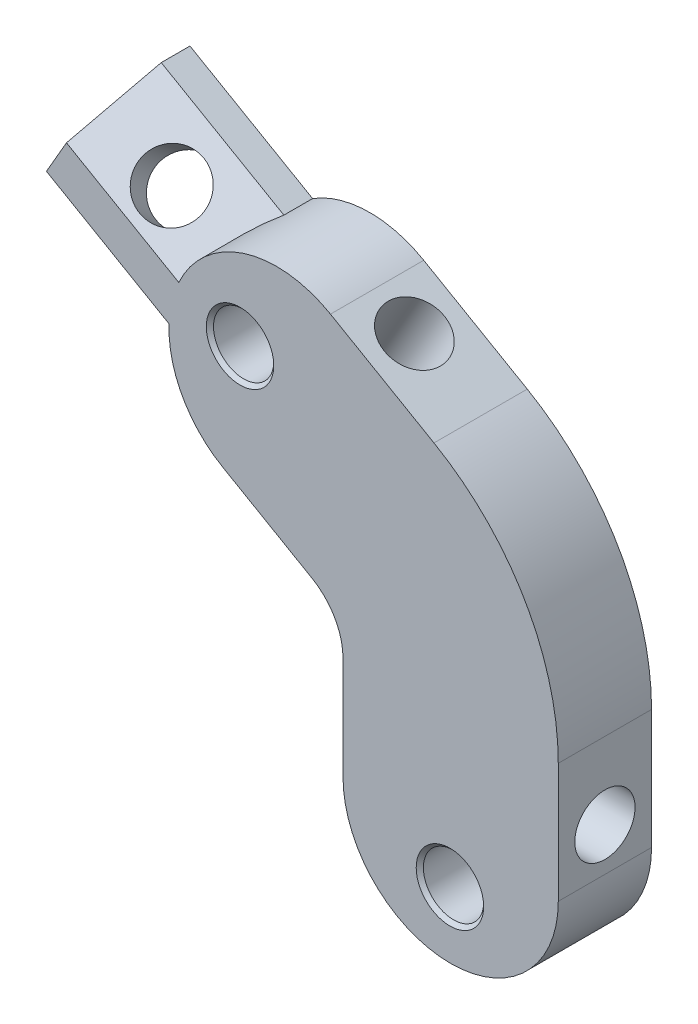
ISO-10303-21;
HEADER;
FILE_DESCRIPTION(('STEP AP214'),'2;1');
FILE_NAME('part.step','',(''),(''),'','','');
FILE_SCHEMA(('AUTOMOTIVE_DESIGN { 1 0 10303 214 1 1 1 1 }'));
ENDSEC;
DATA;
#1=APPLICATION_CONTEXT('core data for automotive mechanical design processes');
#2=APPLICATION_PROTOCOL_DEFINITION('international standard','automotive_design',2000,#1);
#3=PRODUCT_CONTEXT('',#1,'mechanical');
#4=PRODUCT('Part','Part','',(#3));
#5=PRODUCT_RELATED_PRODUCT_CATEGORY('part','',(#4));
#6=PRODUCT_DEFINITION_FORMATION('','',#4);
#7=PRODUCT_DEFINITION_CONTEXT('part definition',#1,'design');
#8=PRODUCT_DEFINITION('design','',#6,#7);
#9=PRODUCT_DEFINITION_SHAPE('','',#8);
#10=(LENGTH_UNIT() NAMED_UNIT(*) SI_UNIT(.MILLI.,.METRE.));
#11=(NAMED_UNIT(*) PLANE_ANGLE_UNIT() SI_UNIT($,.RADIAN.));
#12=(NAMED_UNIT(*) SI_UNIT($,.STERADIAN.) SOLID_ANGLE_UNIT());
#13=UNCERTAINTY_MEASURE_WITH_UNIT(LENGTH_MEASURE(1.E-05),#10,'distance_accuracy_value','');
#14=(GEOMETRIC_REPRESENTATION_CONTEXT(3) GLOBAL_UNCERTAINTY_ASSIGNED_CONTEXT((#13)) GLOBAL_UNIT_ASSIGNED_CONTEXT((#10,
#11,#12)) REPRESENTATION_CONTEXT('',''));
#15=CARTESIAN_POINT('',(0.,0.,0.));
#16=DIRECTION('',(0.,0.,1.));
#17=DIRECTION('',(1.,0.,0.));
#18=AXIS2_PLACEMENT_3D('',#15,#16,#17);
#19=CARTESIAN_POINT('',(-19.6410166168552,-11.3397456934119,13.));
#20=DIRECTION('',(0.,0.,-1.));
#21=DIRECTION('',(-1.,0.,0.));
#22=AXIS2_PLACEMENT_3D('',#19,#20,#21);
#23=CYLINDRICAL_SURFACE('',#22,34.6410161513777);
#24=CARTESIAN_POINT('',(-19.6410166168552,-11.3397456934119,0.));
#25=DIRECTION('',(0.,0.,-1.));
#26=DIRECTION('',(-1.,0.,0.));
#27=AXIS2_PLACEMENT_3D('',#24,#25,#26);
#28=CIRCLE('',#27,34.6410161513777);
#29=CARTESIAN_POINT('',(14.9999995345225,-11.3397456934127,0.));
#30=VERTEX_POINT('',#29);
#31=CARTESIAN_POINT('',(-2.32050854116668,18.6602543065882,0.));
#32=VERTEX_POINT('',#31);
#33=EDGE_CURVE('E219',#30,#32,#28,.F.);
#34=ORIENTED_EDGE('',*,*,#33,.F.);
#35=DIRECTION('',(0.,0.,-1.));
#36=VECTOR('',#35,1.);
#37=CARTESIAN_POINT('',(14.9999995345227,-11.3397456934127,13.));
#38=LINE('',#37,#36);
#39=CARTESIAN_POINT('',(14.9999995345227,-11.3397456934127,-13.));
#40=VERTEX_POINT('',#39);
#41=EDGE_CURVE('E38',#30,#40,#38,.T.);
#42=ORIENTED_EDGE('',*,*,#41,.T.);
#43=CARTESIAN_POINT('',(-19.6410166168552,-11.3397456934119,-13.));
#44=DIRECTION('',(0.,0.,-1.));
#45=DIRECTION('',(-1.,0.,0.));
#46=AXIS2_PLACEMENT_3D('',#43,#44,#45);
#47=CIRCLE('',#46,34.6410161513777);
#48=CARTESIAN_POINT('',(-2.32050854116668,18.6602543065882,-13.));
#49=VERTEX_POINT('',#48);
#50=EDGE_CURVE('E218',#49,#40,#47,.T.);
#51=ORIENTED_EDGE('',*,*,#50,.F.);
#52=DIRECTION('',(0.,0.,-1.));
#53=VECTOR('',#52,1.);
#54=CARTESIAN_POINT('',(-2.32050854116668,18.6602543065882,13.));
#55=LINE('',#54,#53);
#56=EDGE_CURVE('E11',#32,#49,#55,.T.);
#57=ORIENTED_EDGE('',*,*,#56,.F.);
#58=EDGE_LOOP('',(#34,#42,#51,#57));
#59=FACE_BOUND('',#58,.T.);
#60=ADVANCED_FACE('F35',(#59),#23,.T.);
#61=CARTESIAN_POINT('',(-16.7487113059647,26.9903810567665,13.));
#62=DIRECTION('',(0.499999999999985,0.866025403784447,0.));
#63=DIRECTION('',(-0.866025403784447,0.499999999999985,0.));
#64=AXIS2_PLACEMENT_3D('',#61,#62,#63);
#65=PLANE('',#64);
#66=DIRECTION('',(-0.866025403784447,0.499999999999985,0.));
#67=VECTOR('',#66,1.);
#68=CARTESIAN_POINT('',(-16.7487113059647,26.9903810567665,0.));
#69=LINE('',#68,#67);
#70=CARTESIAN_POINT('',(-16.7487113059647,26.9903810567665,0.));
#71=VERTEX_POINT('',#70);
#72=EDGE_CURVE('E610',#32,#71,#69,.T.);
#73=ORIENTED_EDGE('',*,*,#72,.F.);
#74=ORIENTED_EDGE('',*,*,#56,.T.);
#75=DIRECTION('',(0.866025403784447,-0.499999999999985,0.));
#76=VECTOR('',#75,1.);
#77=CARTESIAN_POINT('',(-16.7487113059647,26.9903810567665,-13.));
#78=LINE('',#77,#76);
#79=CARTESIAN_POINT('',(-16.7487113059647,26.9903810567665,-13.));
#80=VERTEX_POINT('',#79);
#81=EDGE_CURVE('E232',#80,#49,#78,.T.);
#82=ORIENTED_EDGE('',*,*,#81,.F.);
#83=DIRECTION('',(0.,0.,-1.));
#84=VECTOR('',#83,1.);
#85=CARTESIAN_POINT('',(-16.7487113059647,26.9903810567665,13.));
#86=LINE('',#85,#84);
#87=EDGE_CURVE('E43',#71,#80,#86,.T.);
#88=ORIENTED_EDGE('',*,*,#87,.F.);
#89=EDGE_LOOP('',(#73,#74,#82,#88));
#90=FACE_BOUND('',#89,.T.);
#91=CARTESIAN_POINT('',(-11.5525588832577,23.9903810567665,-6.5));
#92=DIRECTION('',(-0.499999999999985,-0.866025403784447,0.));
#93=DIRECTION('',(-0.866025403784447,0.499999999999985,0.));
#94=AXIS2_PLACEMENT_3D('',#91,#92,#93);
#95=CIRCLE('',#94,4.20000000000004);
#96=CARTESIAN_POINT('',(-15.1898655791524,26.0903810567664,-6.5));
#97=VERTEX_POINT('',#96);
#98=EDGE_CURVE('E233',#97,#97,#95,.T.);
#99=ORIENTED_EDGE('',*,*,#98,.T.);
#100=EDGE_LOOP('',(#99));
#101=FACE_BOUND('',#100,.T.);
#102=ADVANCED_FACE('F309',(#90,#101),#65,.T.);
#103=CARTESIAN_POINT('',(-24.2487113059644,14.,13.));
#104=DIRECTION('',(0.,0.,-1.));
#105=DIRECTION('',(-1.,0.,0.));
#106=AXIS2_PLACEMENT_3D('',#103,#104,#105);
#107=CYLINDRICAL_SURFACE('',#106,14.9999999999998);
#108=CARTESIAN_POINT('',(-24.2487113059644,14.,0.));
#109=DIRECTION('',(0.,0.,-1.));
#110=DIRECTION('',(-1.,0.,0.));
#111=AXIS2_PLACEMENT_3D('',#108,#109,#110);
#112=CIRCLE('',#111,14.9999999999998);
#113=CARTESIAN_POINT('',(-37.8866435687405,20.245542698271,0.));
#114=VERTEX_POINT('',#113);
#115=EDGE_CURVE('E51',#71,#114,#112,.F.);
#116=ORIENTED_EDGE('',*,*,#115,.F.);
#117=ORIENTED_EDGE('',*,*,#87,.T.);
#118=CARTESIAN_POINT('',(-24.248711305964,13.9999999999998,-13.));
#119=DIRECTION('',(0.,0.,-1.));
#120=DIRECTION('',(-1.,0.,0.));
#121=AXIS2_PLACEMENT_3D('',#118,#119,#120);
#122=CIRCLE('',#121,15.0000000000002);
#123=CARTESIAN_POINT('',(-32.2378365990401,26.6954274072018,-13.));
#124=VERTEX_POINT('',#123);
#125=EDGE_CURVE('E256',#124,#80,#122,.T.);
#126=ORIENTED_EDGE('',*,*,#125,.F.);
#127=DIRECTION('',(0.,0.,1.));
#128=VECTOR('',#127,1.);
#129=CARTESIAN_POINT('',(-32.2378365990401,26.6954274072018,-13.));
#130=LINE('',#129,#128);
#131=CARTESIAN_POINT('',(-32.2378365990401,26.6954274072018,-9.00000000000002));
#132=VERTEX_POINT('',#131);
#133=EDGE_CURVE('E145',#124,#132,#130,.T.);
#134=ORIENTED_EDGE('',*,*,#133,.T.);
#135=CARTESIAN_POINT('',(-24.2487113059644,14.,-1.50906714486256));
#136=DIRECTION('',(0.365321701822529,0.632755748664128,0.68275926702608));
#137=DIRECTION('',(-0.341379633513048,-0.591286869913824,0.730643403645041));
#138=AXIS2_PLACEMENT_3D('',#135,#136,#137);
#139=ELLIPSE('',#138,21.969676172007,14.9999999999998);
#140=EDGE_CURVE('E159',#114,#132,#139,.F.);
#141=ORIENTED_EDGE('',*,*,#140,.F.);
#142=EDGE_LOOP('',(#116,#117,#126,#134,#141));
#143=FACE_BOUND('',#142,.T.);
#144=ADVANCED_FACE('F313',(#143),#107,.T.);
#145=CARTESIAN_POINT('',(-52.8275496308505,30.5000000000002,13.));
#146=DIRECTION('',(-0.866025403784432,0.500000000000012,0.));
#147=DIRECTION('',(-0.500000000000012,-0.866025403784432,0.));
#148=AXIS2_PLACEMENT_3D('',#145,#146,#147);
#149=PLANE('',#148);
#150=DIRECTION('',(-0.500000000000012,-0.866025403784432,0.));
#151=VECTOR('',#150,1.);
#152=CARTESIAN_POINT('',(-52.8275496308505,30.5000000000002,0.));
#153=LINE('',#152,#151);
#154=CARTESIAN_POINT('',(-53.532633377983,29.2787591263756,0.));
#155=VERTEX_POINT('',#154);
#156=CARTESIAN_POINT('',(-56.3275496308506,24.4378221735092,0.));
#157=VERTEX_POINT('',#156);
#158=EDGE_CURVE('E138',#155,#157,#153,.T.);
#159=ORIENTED_EDGE('',*,*,#158,.F.);
#160=DIRECTION('',(0.341379633513048,0.591286869913824,-0.730643403645041));
#161=VECTOR('',#160,1.);
#162=CARTESIAN_POINT('',(-49.9614032798751,35.4643111018175,-7.64338425004915));
#163=LINE('',#162,#161);
#164=CARTESIAN_POINT('',(-49.3275496308504,36.5621778264912,-9.00000000000002));
#165=VERTEX_POINT('',#164);
#166=EDGE_CURVE('E151',#165,#155,#163,.F.);
#167=ORIENTED_EDGE('',*,*,#166,.F.);
#168=DIRECTION('',(0.,0.,1.));
#169=VECTOR('',#168,1.);
#170=CARTESIAN_POINT('',(-49.3275496308504,36.5621778264912,-13.));
#171=LINE('',#170,#169);
#172=CARTESIAN_POINT('',(-49.3275496308504,36.5621778264912,-13.));
#173=VERTEX_POINT('',#172);
#174=EDGE_CURVE('E259',#173,#165,#171,.T.);
#175=ORIENTED_EDGE('',*,*,#174,.F.);
#176=DIRECTION('',(0.500000000000011,0.866025403784432,0.));
#177=VECTOR('',#176,1.);
#178=CARTESIAN_POINT('',(-52.8275496308505,30.5000000000002,-13.));
#179=LINE('',#178,#177);
#180=CARTESIAN_POINT('',(-52.3275496308504,31.3660254037847,-13.));
#181=VERTEX_POINT('',#180);
#182=EDGE_CURVE('E252',#181,#173,#179,.T.);
#183=ORIENTED_EDGE('',*,*,#182,.F.);
#184=DIRECTION('',(0.34137963351305,0.591286869913826,-0.730643403645038));
#185=VECTOR('',#184,1.);
#186=CARTESIAN_POINT('',(-52.5606297392055,30.9623188138801,-12.5011464452699));
#187=LINE('',#186,#185);
#188=CARTESIAN_POINT('',(-56.3275496308506,24.4378221735092,-4.43893387984284));
#189=VERTEX_POINT('',#188);
#190=EDGE_CURVE('E167',#189,#181,#187,.T.);
#191=ORIENTED_EDGE('',*,*,#190,.F.);
#192=DIRECTION('',(0.,0.,-1.));
#193=VECTOR('',#192,1.);
#194=CARTESIAN_POINT('',(-56.3275496308505,24.4378221735092,13.));
#195=LINE('',#194,#193);
#196=EDGE_CURVE('E154',#157,#189,#195,.T.);
#197=ORIENTED_EDGE('',*,*,#196,.F.);
#198=EDGE_LOOP('',(#159,#167,#175,#183,#191,#197));
#199=FACE_BOUND('',#198,.T.);
#200=ADVANCED_FACE('F149',(#199),#149,.T.);
#201=CARTESIAN_POINT('',(-56.3275496308505,24.4378221735092,13.));
#202=DIRECTION('',(-0.500000000000012,-0.866025403784432,0.));
#203=DIRECTION('',(0.866025403784432,-0.500000000000012,0.));
#204=AXIS2_PLACEMENT_3D('',#201,#202,#203);
#205=PLANE('',#204);
#206=DIRECTION('',(0.866025403784432,-0.500000000000012,0.));
#207=VECTOR('',#206,1.);
#208=CARTESIAN_POINT('',(-56.3275496308505,24.4378221735092,0.));
#209=LINE('',#208,#207);
#210=CARTESIAN_POINT('',(-39.2378365990403,14.5710717542198,0.));
#211=VERTEX_POINT('',#210);
#212=EDGE_CURVE('E274',#157,#211,#209,.T.);
#213=ORIENTED_EDGE('',*,*,#212,.F.);
#214=ORIENTED_EDGE('',*,*,#196,.T.);
#215=DIRECTION('',(-0.866025403784432,0.500000000000012,0.));
#216=VECTOR('',#215,1.);
#217=CARTESIAN_POINT('',(-56.3275496308505,24.4378221735092,-4.43893387984285));
#218=LINE('',#217,#216);
#219=CARTESIAN_POINT('',(-39.2378365990403,14.5710717542198,-4.43893387984285));
#220=VERTEX_POINT('',#219);
#221=EDGE_CURVE('E161',#220,#189,#218,.T.);
#222=ORIENTED_EDGE('',*,*,#221,.F.);
#223=DIRECTION('',(0.,0.,-1.));
#224=VECTOR('',#223,1.);
#225=CARTESIAN_POINT('',(-39.2378365990403,14.5710717542198,13.));
#226=LINE('',#225,#224);
#227=EDGE_CURVE('E197',#211,#220,#226,.T.);
#228=ORIENTED_EDGE('',*,*,#227,.F.);
#229=EDGE_LOOP('',(#213,#214,#222,#228));
#230=FACE_BOUND('',#229,.T.);
#231=ADVANCED_FACE('F273',(#230),#205,.T.);
#232=CARTESIAN_POINT('',(-24.248711305964,13.9999999999998,13.));
#233=DIRECTION('',(0.,0.,-1.));
#234=DIRECTION('',(-1.,0.,0.));
#235=AXIS2_PLACEMENT_3D('',#232,#233,#234);
#236=CYLINDRICAL_SURFACE('',#235,15.0000000000002);
#237=CARTESIAN_POINT('',(-24.248711305964,13.9999999999998,0.));
#238=DIRECTION('',(0.,0.,-1.));
#239=DIRECTION('',(-1.,0.,0.));
#240=AXIS2_PLACEMENT_3D('',#237,#238,#239);
#241=CIRCLE('',#240,15.0000000000002);
#242=CARTESIAN_POINT('',(-31.7487113059642,1.00961894323307,0.));
#243=VERTEX_POINT('',#242);
#244=EDGE_CURVE('E276',#211,#243,#241,.F.);
#245=ORIENTED_EDGE('',*,*,#244,.F.);
#246=ORIENTED_EDGE('',*,*,#227,.T.);
#247=CARTESIAN_POINT('',(-24.248711305964,13.9999999999998,-11.9298667349804));
#248=DIRECTION('',(0.365321701822527,0.632755748664126,0.682759267026083));
#249=DIRECTION('',(-0.341379633513049,-0.591286869913826,0.730643403645038));
#250=AXIS2_PLACEMENT_3D('',#247,#248,#249);
#251=ELLIPSE('',#250,21.9696761720075,15.0000000000002);
#252=CARTESIAN_POINT('',(-36.71019270278,22.3493401773325,-13.));
#253=VERTEX_POINT('',#252);
#254=EDGE_CURVE('E170',#253,#220,#251,.T.);
#255=ORIENTED_EDGE('',*,*,#254,.F.);
#256=CARTESIAN_POINT('',(-24.2487113059644,14.,-13.));
#257=DIRECTION('',(0.,0.,-1.));
#258=DIRECTION('',(-1.,0.,0.));
#259=AXIS2_PLACEMENT_3D('',#256,#257,#258);
#260=CIRCLE('',#259,15.);
#261=CARTESIAN_POINT('',(-31.7487113059642,1.00961894323327,-13.));
#262=VERTEX_POINT('',#261);
#263=EDGE_CURVE('E250',#262,#253,#260,.T.);
#264=ORIENTED_EDGE('',*,*,#263,.F.);
#265=DIRECTION('',(0.,0.,-1.));
#266=VECTOR('',#265,1.);
#267=CARTESIAN_POINT('',(-31.7487113059642,1.00961894323327,13.));
#268=LINE('',#267,#266);
#269=EDGE_CURVE('E199',#243,#262,#268,.T.);
#270=ORIENTED_EDGE('',*,*,#269,.F.);
#271=EDGE_LOOP('',(#245,#246,#255,#264,#270));
#272=FACE_BOUND('',#271,.T.);
#273=ADVANCED_FACE('F331',(#272),#236,.T.);
#274=CARTESIAN_POINT('',(-19.3301274843998,-6.160253769101,13.));
#275=DIRECTION('',(-0.5,-0.866025403784439,0.));
#276=DIRECTION('',(0.866025403784439,-0.5,0.));
#277=AXIS2_PLACEMENT_3D('',#274,#275,#276);
#278=PLANE('',#277);
#279=DIRECTION('',(0.866025403784439,-0.5,0.));
#280=VECTOR('',#279,1.);
#281=CARTESIAN_POINT('',(-19.3301274843998,-6.160253769101,0.));
#282=LINE('',#281,#280);
#283=CARTESIAN_POINT('',(-19.3301274843998,-6.16025376910101,0.));
#284=VERTEX_POINT('',#283);
#285=EDGE_CURVE('E280',#243,#284,#282,.T.);
#286=ORIENTED_EDGE('',*,*,#285,.F.);
#287=ORIENTED_EDGE('',*,*,#269,.T.);
#288=DIRECTION('',(-0.866025403784439,0.5,0.));
#289=VECTOR('',#288,1.);
#290=CARTESIAN_POINT('',(-19.3301274843998,-6.160253769101,-13.));
#291=LINE('',#290,#289);
#292=CARTESIAN_POINT('',(-19.3301274843998,-6.160253769101,-13.));
#293=VERTEX_POINT('',#292);
#294=EDGE_CURVE('E247',#293,#262,#291,.T.);
#295=ORIENTED_EDGE('',*,*,#294,.F.);
#296=DIRECTION('',(0.,0.,-1.));
#297=VECTOR('',#296,1.);
#298=CARTESIAN_POINT('',(-19.3301274843998,-6.160253769101,13.));
#299=LINE('',#298,#297);
#300=EDGE_CURVE('E201',#284,#293,#299,.T.);
#301=ORIENTED_EDGE('',*,*,#300,.F.);
#302=EDGE_LOOP('',(#286,#287,#295,#301));
#303=FACE_BOUND('',#302,.T.);
#304=CARTESIAN_POINT('',(-26.5525588832578,-1.99038105676678,-6.5));
#305=DIRECTION('',(0.5,0.866025403784439,0.));
#306=DIRECTION('',(0.866025403784439,-0.5,0.));
#307=AXIS2_PLACEMENT_3D('',#304,#305,#306);
#308=CIRCLE('',#307,4.20000000000004);
#309=CARTESIAN_POINT('',(-22.9152521873631,-4.09038105676679,-6.5));
#310=VERTEX_POINT('',#309);
#311=EDGE_CURVE('E236',#310,#310,#308,.T.);
#312=ORIENTED_EDGE('',*,*,#311,.T.);
#313=EDGE_LOOP('',(#312));
#314=FACE_BOUND('',#313,.T.);
#315=ADVANCED_FACE('F291',(#303,#314),#278,.T.);
#316=CARTESIAN_POINT('',(-23.6602545033224,-13.6602537691016,13.));
#317=DIRECTION('',(0.,0.,-1.));
#318=DIRECTION('',(-1.,0.,0.));
#319=AXIS2_PLACEMENT_3D('',#316,#317,#318);
#320=CYLINDRICAL_SURFACE('',#319,8.66025403784512);
#321=CARTESIAN_POINT('',(-23.6602545033224,-13.6602537691016,0.));
#322=DIRECTION('',(0.,0.,-1.));
#323=DIRECTION('',(-1.,0.,0.));
#324=AXIS2_PLACEMENT_3D('',#321,#322,#323);
#325=CIRCLE('',#324,8.66025403784512);
#326=CARTESIAN_POINT('',(-15.0000004654773,-13.6602537691016,0.));
#327=VERTEX_POINT('',#326);
#328=EDGE_CURVE('E619',#284,#327,#325,.T.);
#329=ORIENTED_EDGE('',*,*,#328,.F.);
#330=ORIENTED_EDGE('',*,*,#300,.T.);
#331=CARTESIAN_POINT('',(-23.6602545033224,-13.6602537691016,-13.));
#332=DIRECTION('',(0.,0.,1.));
#333=DIRECTION('',(1.,0.,0.));
#334=AXIS2_PLACEMENT_3D('',#331,#332,#333);
#335=CIRCLE('',#334,8.66025403784512);
#336=CARTESIAN_POINT('',(-15.0000004654773,-13.6602537691016,-13.));
#337=VERTEX_POINT('',#336);
#338=EDGE_CURVE('E244',#337,#293,#335,.T.);
#339=ORIENTED_EDGE('',*,*,#338,.F.);
#340=DIRECTION('',(0.,0.,-1.));
#341=VECTOR('',#340,1.);
#342=CARTESIAN_POINT('',(-15.0000004654773,-13.6602537691016,13.));
#343=LINE('',#342,#341);
#344=EDGE_CURVE('E203',#327,#337,#343,.T.);
#345=ORIENTED_EDGE('',*,*,#344,.F.);
#346=EDGE_LOOP('',(#329,#330,#339,#345));
#347=FACE_BOUND('',#346,.T.);
#348=ADVANCED_FACE('F337',(#347),#320,.F.);
#349=CARTESIAN_POINT('',(-15.0000004654777,-27.9999997312591,13.));
#350=DIRECTION('',(-1.,0.,0.));
#351=DIRECTION('',(0.,-1.,0.));
#352=AXIS2_PLACEMENT_3D('',#349,#350,#351);
#353=PLANE('',#352);
#354=DIRECTION('',(0.,-1.,0.));
#355=VECTOR('',#354,1.);
#356=CARTESIAN_POINT('',(-15.0000004654777,-27.9999997312591,0.));
#357=LINE('',#356,#355);
#358=CARTESIAN_POINT('',(-15.0000004654777,-27.9999997312591,0.));
#359=VERTEX_POINT('',#358);
#360=EDGE_CURVE('E617',#327,#359,#357,.T.);
#361=ORIENTED_EDGE('',*,*,#360,.F.);
#362=ORIENTED_EDGE('',*,*,#344,.T.);
#363=DIRECTION('',(0.,1.,0.));
#364=VECTOR('',#363,1.);
#365=CARTESIAN_POINT('',(-15.0000004654777,-27.9999997312591,-13.));
#366=LINE('',#365,#364);
#367=CARTESIAN_POINT('',(-15.0000004654777,-27.9999997312591,-13.));
#368=VERTEX_POINT('',#367);
#369=EDGE_CURVE('E241',#368,#337,#366,.T.);
#370=ORIENTED_EDGE('',*,*,#369,.F.);
#371=DIRECTION('',(0.,0.,-1.));
#372=VECTOR('',#371,1.);
#373=CARTESIAN_POINT('',(-15.0000004654777,-27.9999997312591,13.));
#374=LINE('',#373,#372);
#375=EDGE_CURVE('E205',#359,#368,#374,.T.);
#376=ORIENTED_EDGE('',*,*,#375,.F.);
#377=EDGE_LOOP('',(#361,#362,#370,#376));
#378=FACE_BOUND('',#377,.T.);
#379=CARTESIAN_POINT('',(-15.0000004654769,-21.9999999999996,-6.5));
#380=DIRECTION('',(1.,0.,0.));
#381=DIRECTION('',(0.,-1.,0.));
#382=AXIS2_PLACEMENT_3D('',#379,#380,#381);
#383=CIRCLE('',#382,4.19999999999998);
#384=CARTESIAN_POINT('',(-15.0000004654769,-26.1999999999995,-6.5));
#385=VERTEX_POINT('',#384);
#386=EDGE_CURVE('E176',#385,#385,#383,.T.);
#387=ORIENTED_EDGE('',*,*,#386,.T.);
#388=EDGE_LOOP('',(#387));
#389=FACE_BOUND('',#388,.T.);
#390=ADVANCED_FACE('F341',(#378,#389),#353,.T.);
#391=CARTESIAN_POINT('',(-4.65477723317609E-07,-27.9999997312591,13.));
#392=DIRECTION('',(0.,0.,-1.));
#393=DIRECTION('',(-1.,0.,0.));
#394=AXIS2_PLACEMENT_3D('',#391,#392,#393);
#395=CYLINDRICAL_SURFACE('',#394,15.);
#396=CARTESIAN_POINT('',(-4.65477723317609E-07,-27.9999997312591,0.));
#397=DIRECTION('',(0.,0.,-1.));
#398=DIRECTION('',(-1.,0.,0.));
#399=AXIS2_PLACEMENT_3D('',#396,#397,#398);
#400=CIRCLE('',#399,15.);
#401=CARTESIAN_POINT('',(14.9999995345223,-27.9999997312591,0.));
#402=VERTEX_POINT('',#401);
#403=EDGE_CURVE('E615',#359,#402,#400,.F.);
#404=ORIENTED_EDGE('',*,*,#403,.F.);
#405=ORIENTED_EDGE('',*,*,#375,.T.);
#406=CARTESIAN_POINT('',(-4.65477723317609E-07,-27.9999997312591,-13.));
#407=DIRECTION('',(0.,0.,-1.));
#408=DIRECTION('',(-1.,0.,0.));
#409=AXIS2_PLACEMENT_3D('',#406,#407,#408);
#410=CIRCLE('',#409,15.);
#411=CARTESIAN_POINT('',(14.9999995345223,-27.9999997312591,-13.));
#412=VERTEX_POINT('',#411);
#413=EDGE_CURVE('E226',#412,#368,#410,.T.);
#414=ORIENTED_EDGE('',*,*,#413,.F.);
#415=DIRECTION('',(0.,0.,-1.));
#416=VECTOR('',#415,1.);
#417=CARTESIAN_POINT('',(14.9999995345223,-27.9999997312591,13.));
#418=LINE('',#417,#416);
#419=EDGE_CURVE('E206',#402,#412,#418,.T.);
#420=ORIENTED_EDGE('',*,*,#419,.F.);
#421=EDGE_LOOP('',(#404,#405,#414,#420));
#422=FACE_BOUND('',#421,.T.);
#423=ADVANCED_FACE('F345',(#422),#395,.T.);
#424=CARTESIAN_POINT('',(14.9999995345227,-11.3397456934127,13.));
#425=DIRECTION('',(1.,0.,0.));
#426=DIRECTION('',(0.,1.,0.));
#427=AXIS2_PLACEMENT_3D('',#424,#425,#426);
#428=PLANE('',#427);
#429=DIRECTION('',(0.,1.,0.));
#430=VECTOR('',#429,1.);
#431=CARTESIAN_POINT('',(14.9999995345227,-11.3397456934127,0.));
#432=LINE('',#431,#430);
#433=EDGE_CURVE('E613',#402,#30,#432,.T.);
#434=ORIENTED_EDGE('',*,*,#433,.F.);
#435=ORIENTED_EDGE('',*,*,#419,.T.);
#436=DIRECTION('',(0.,-1.,0.));
#437=VECTOR('',#436,1.);
#438=CARTESIAN_POINT('',(14.9999995345227,-11.3397456934127,-13.));
#439=LINE('',#438,#437);
#440=EDGE_CURVE('E220',#40,#412,#439,.T.);
#441=ORIENTED_EDGE('',*,*,#440,.F.);
#442=ORIENTED_EDGE('',*,*,#41,.F.);
#443=EDGE_LOOP('',(#434,#435,#441,#442));
#444=FACE_BOUND('',#443,.T.);
#445=CARTESIAN_POINT('',(14.9999995345227,-21.9999999999996,-6.5));
#446=DIRECTION('',(1.,0.,0.));
#447=DIRECTION('',(0.,-1.,0.));
#448=AXIS2_PLACEMENT_3D('',#445,#446,#447);
#449=CIRCLE('',#448,4.19999999999998);
#450=CARTESIAN_POINT('',(14.9999995345227,-26.1999999999995,-6.5));
#451=VERTEX_POINT('',#450);
#452=EDGE_CURVE('E284',#451,#451,#449,.T.);
#453=ORIENTED_EDGE('',*,*,#452,.F.);
#454=EDGE_LOOP('',(#453));
#455=FACE_BOUND('',#454,.T.);
#456=ADVANCED_FACE('F221',(#444,#455),#428,.T.);
#457=CARTESIAN_POINT('',(-49.3275496308504,36.5621778264912,-13.));
#458=DIRECTION('',(0.500000000000012,0.866025403784432,0.));
#459=DIRECTION('',(-0.866025403784432,0.500000000000012,0.));
#460=AXIS2_PLACEMENT_3D('',#457,#458,#459);
#461=PLANE('',#460);
#462=ORIENTED_EDGE('',*,*,#133,.F.);
#463=DIRECTION('',(0.866025403784432,-0.500000000000012,0.));
#464=VECTOR('',#463,1.);
#465=CARTESIAN_POINT('',(-49.3275496308504,36.5621778264912,-13.));
#466=LINE('',#465,#464);
#467=EDGE_CURVE('E254',#173,#124,#466,.T.);
#468=ORIENTED_EDGE('',*,*,#467,.F.);
#469=ORIENTED_EDGE('',*,*,#174,.T.);
#470=DIRECTION('',(-0.866025403784432,0.500000000000012,0.));
#471=VECTOR('',#470,1.);
#472=CARTESIAN_POINT('',(-49.3275496308504,36.5621778264912,-9.00000000000002));
#473=LINE('',#472,#471);
#474=EDGE_CURVE('E144',#132,#165,#473,.T.);
#475=ORIENTED_EDGE('',*,*,#474,.F.);
#476=EDGE_LOOP('',(#462,#468,#469,#475));
#477=FACE_BOUND('',#476,.T.);
#478=ADVANCED_FACE('F265',(#477),#461,.T.);
#479=CARTESIAN_POINT('',(-19.6410166168552,-11.3397456934119,-13.));
#480=DIRECTION('',(0.,0.,1.));
#481=DIRECTION('',(-1.,0.,0.));
#482=AXIS2_PLACEMENT_3D('',#479,#480,#481);
#483=PLANE('',#482);
#484=CARTESIAN_POINT('',(-0.0974320970730236,-33.8312426575785,-13.));
#485=DIRECTION('',(0.,0.,-1.));
#486=DIRECTION('',(-1.,0.,0.));
#487=AXIS2_PLACEMENT_3D('',#484,#485,#486);
#488=CIRCLE('',#487,4.69999999999998);
#489=CARTESIAN_POINT('',(-4.797432097073,-33.8312426575785,-13.));
#490=VERTEX_POINT('',#489);
#491=EDGE_CURVE('E192',#490,#490,#488,.T.);
#492=ORIENTED_EDGE('',*,*,#491,.F.);
#493=EDGE_LOOP('',(#492));
#494=FACE_BOUND('',#493,.T.);
#495=CARTESIAN_POINT('',(-29.3474320970753,16.8312434638099,-13.));
#496=DIRECTION('',(0.,0.,-1.));
#497=DIRECTION('',(-1.,0.,0.));
#498=AXIS2_PLACEMENT_3D('',#495,#496,#497);
#499=CIRCLE('',#498,4.70000000000001);
#500=CARTESIAN_POINT('',(-34.0474320970753,16.8312434638099,-13.));
#501=VERTEX_POINT('',#500);
#502=EDGE_CURVE('E189',#501,#501,#499,.T.);
#503=ORIENTED_EDGE('',*,*,#502,.F.);
#504=EDGE_LOOP('',(#503));
#505=FACE_BOUND('',#504,.T.);
#506=ORIENTED_EDGE('',*,*,#182,.T.);
#507=ORIENTED_EDGE('',*,*,#467,.T.);
#508=ORIENTED_EDGE('',*,*,#125,.T.);
#509=ORIENTED_EDGE('',*,*,#81,.T.);
#510=ORIENTED_EDGE('',*,*,#50,.T.);
#511=ORIENTED_EDGE('',*,*,#440,.T.);
#512=ORIENTED_EDGE('',*,*,#413,.T.);
#513=ORIENTED_EDGE('',*,*,#369,.T.);
#514=ORIENTED_EDGE('',*,*,#338,.T.);
#515=ORIENTED_EDGE('',*,*,#294,.T.);
#516=ORIENTED_EDGE('',*,*,#263,.T.);
#517=DIRECTION('',(0.866025403784432,-0.500000000000012,0.));
#518=VECTOR('',#517,1.);
#519=CARTESIAN_POINT('',(-35.2378365990402,21.4992749844952,-13.));
#520=LINE('',#519,#518);
#521=EDGE_CURVE('E59',#181,#253,#520,.T.);
#522=ORIENTED_EDGE('',*,*,#521,.F.);
#523=EDGE_LOOP('',(#506,#507,#508,#509,#510,#511,#512,#513,#514,#515,#516,#522));
#524=FACE_BOUND('',#523,.T.);
#525=ADVANCED_FACE('F229',(#494,#505,#524),#483,.F.);
#526=CARTESIAN_POINT('',(0.529328408085759,44.9168236966941,-6.5));
#527=DIRECTION('',(-0.5,-0.866025403784439,0.));
#528=DIRECTION('',(0.866025403784439,-0.5,0.));
#529=AXIS2_PLACEMENT_3D('',#526,#527,#528);
#530=CYLINDRICAL_SURFACE('',#529,4.20000000000004);
#531=ORIENTED_EDGE('',*,*,#98,.F.);
#532=EDGE_LOOP('',(#531));
#533=FACE_BOUND('',#532,.T.);
#534=ORIENTED_EDGE('',*,*,#311,.F.);
#535=EDGE_LOOP('',(#534));
#536=FACE_BOUND('',#535,.T.);
#537=ADVANCED_FACE('F293',(#533,#536),#530,.F.);
#538=CARTESIAN_POINT('',(14.9999995345227,-21.9999999999996,-6.5));
#539=DIRECTION('',(-1.,0.,0.));
#540=DIRECTION('',(0.,-1.,0.));
#541=AXIS2_PLACEMENT_3D('',#538,#539,#540);
#542=CYLINDRICAL_SURFACE('',#541,4.19999999999998);
#543=CARTESIAN_POINT('',(-15.0000004654769,-26.1999999999995,-6.5));
#544=CARTESIAN_POINT('',(-14.6875004654769,-26.1999999999995,-6.5));
#545=CARTESIAN_POINT('',(-14.3750004654769,-26.1999999999995,-6.5));
#546=CARTESIAN_POINT('',(-13.7500004654769,-26.1999999999995,-6.5));
#547=CARTESIAN_POINT('',(-13.4375004654769,-26.1999999999995,-6.5));
#548=CARTESIAN_POINT('',(-12.8125004654769,-26.1999999999995,-6.5));
#549=CARTESIAN_POINT('',(-12.5000004654769,-26.1999999999995,-6.5));
#550=CARTESIAN_POINT('',(-11.8750004654769,-26.1999999999995,-6.5));
#551=CARTESIAN_POINT('',(-11.5625004654769,-26.1999999999995,-6.5));
#552=CARTESIAN_POINT('',(-10.9375004654769,-26.1999999999995,-6.5));
#553=CARTESIAN_POINT('',(-10.6250004654769,-26.1999999999995,-6.5));
#554=CARTESIAN_POINT('',(-10.0000004654769,-26.1999999999995,-6.5));
#555=CARTESIAN_POINT('',(-9.68750046547694,-26.1999999999995,-6.5));
#556=CARTESIAN_POINT('',(-9.06250046547695,-26.1999999999995,-6.5));
#557=CARTESIAN_POINT('',(-8.75000046547695,-26.1999999999995,-6.5));
#558=CARTESIAN_POINT('',(-8.12500046547696,-26.1999999999995,-6.5));
#559=CARTESIAN_POINT('',(-7.81250046547697,-26.1999999999995,-6.5));
#560=CARTESIAN_POINT('',(-7.18750046547698,-26.1999999999995,-6.5));
#561=CARTESIAN_POINT('',(-6.87500046547698,-26.1999999999995,-6.5));
#562=CARTESIAN_POINT('',(-6.25000046547699,-26.1999999999995,-6.5));
#563=CARTESIAN_POINT('',(-5.93750046547699,-26.1999999999995,-6.5));
#564=CARTESIAN_POINT('',(-5.312500465477,-26.1999999999995,-6.5));
#565=CARTESIAN_POINT('',(-5.000000465477,-26.1999999999995,-6.5));
#566=CARTESIAN_POINT('',(-4.37500046547701,-26.1999999999995,-6.5));
#567=CARTESIAN_POINT('',(-4.06250046547702,-26.1999999999995,-6.5));
#568=CARTESIAN_POINT('',(-3.43750046547702,-26.1999999999995,-6.5));
#569=CARTESIAN_POINT('',(-3.12500046547703,-26.1999999999995,-6.5));
#570=CARTESIAN_POINT('',(-2.50000046547704,-26.1999999999995,-6.5));
#571=CARTESIAN_POINT('',(-2.18750046547704,-26.1999999999995,-6.5));
#572=CARTESIAN_POINT('',(-1.56250046547705,-26.1999999999995,-6.5));
#573=CARTESIAN_POINT('',(-1.25000046547705,-26.1999999999995,-6.5));
#574=CARTESIAN_POINT('',(-0.625000465477064,-26.1999999999995,-6.5));
#575=CARTESIAN_POINT('',(-0.312500465477069,-26.1999999999995,-6.5));
#576=CARTESIAN_POINT('',(0.312499534522922,-26.1999999999995,-6.5));
#577=CARTESIAN_POINT('',(0.624999534522918,-26.1999999999995,-6.5));
#578=CARTESIAN_POINT('',(1.24999953452291,-26.1999999999995,-6.5));
#579=CARTESIAN_POINT('',(1.5624995345229,-26.1999999999995,-6.5));
#580=CARTESIAN_POINT('',(2.1874995345229,-26.1999999999995,-6.5));
#581=CARTESIAN_POINT('',(2.49999953452289,-26.1999999999995,-6.5));
#582=CARTESIAN_POINT('',(3.12499953452288,-26.1999999999995,-6.5));
#583=CARTESIAN_POINT('',(3.43749953452288,-26.1999999999995,-6.5));
#584=CARTESIAN_POINT('',(4.06249953452287,-26.1999999999995,-6.5));
#585=CARTESIAN_POINT('',(4.37499953452287,-26.1999999999995,-6.5));
#586=CARTESIAN_POINT('',(4.99999953452286,-26.1999999999995,-6.5));
#587=CARTESIAN_POINT('',(5.31249953452286,-26.1999999999995,-6.5));
#588=CARTESIAN_POINT('',(5.93749953452285,-26.1999999999995,-6.5));
#589=CARTESIAN_POINT('',(6.24999953452284,-26.1999999999995,-6.5));
#590=CARTESIAN_POINT('',(6.87499953452283,-26.1999999999995,-6.5));
#591=CARTESIAN_POINT('',(7.18749953452283,-26.1999999999995,-6.5));
#592=CARTESIAN_POINT('',(7.81249953452282,-26.1999999999995,-6.5));
#593=CARTESIAN_POINT('',(8.12499953452282,-26.1999999999995,-6.5));
#594=CARTESIAN_POINT('',(8.74999953452281,-26.1999999999995,-6.5));
#595=CARTESIAN_POINT('',(9.0624995345228,-26.1999999999995,-6.5));
#596=CARTESIAN_POINT('',(9.68749953452279,-26.1999999999995,-6.5));
#597=CARTESIAN_POINT('',(9.99999953452279,-26.1999999999995,-6.5));
#598=CARTESIAN_POINT('',(10.6249995345228,-26.1999999999995,-6.5));
#599=CARTESIAN_POINT('',(10.9374995345228,-26.1999999999995,-6.5));
#600=CARTESIAN_POINT('',(11.5624995345228,-26.1999999999995,-6.5));
#601=CARTESIAN_POINT('',(11.8749995345228,-26.1999999999995,-6.5));
#602=CARTESIAN_POINT('',(12.4999995345228,-26.1999999999995,-6.5));
#603=CARTESIAN_POINT('',(12.8124995345228,-26.1999999999995,-6.5));
#604=CARTESIAN_POINT('',(13.4374995345227,-26.1999999999995,-6.5));
#605=CARTESIAN_POINT('',(13.7499995345227,-26.1999999999995,-6.5));
#606=CARTESIAN_POINT('',(14.3749995345227,-26.1999999999995,-6.5));
#607=CARTESIAN_POINT('',(14.6874995345227,-26.1999999999995,-6.5));
#608=CARTESIAN_POINT('',(14.9999995345227,-26.1999999999995,-6.5));
#609=B_SPLINE_CURVE_WITH_KNOTS('',3,(#543,#544,#545,#546,#547,#548,#549,#550,#551,#552,#553,
#554,#555,#556,#557,#558,#559,#560,#561,#562,#563,#564,#565,#566,#567,#568,#569,#570,#571,#572,
#573,#574,#575,#576,#577,#578,#579,#580,#581,#582,#583,#584,#585,#586,#587,#588,#589,#590,#591,
#592,#593,#594,#595,#596,#597,#598,#599,#600,#601,#602,#603,#604,#605,#606,#607,#608),
.UNSPECIFIED.,.F.,.F.,(4,2,2,2,2,2,2,2,2,2,2,2,2,2,2,2,2,2,2,2,2,2,2,2,2,2,2,2,2,2,2,2,4),(0.,
0.937499999999987,1.87499999999997,2.81249999999996,3.74999999999995,4.68749999999994,
5.62499999999993,6.56249999999991,7.4999999999999,8.43749999999989,9.37499999999987,
10.3124999999999,11.2499999999999,12.1874999999998,13.1249999999998,14.0624999999998,
14.9999999999998,15.9374999999998,16.8749999999998,17.8124999999998,18.7499999999997,
19.6874999999997,20.6249999999997,21.5624999999997,22.4999999999997,23.4374999999997,
24.3749999999997,25.3124999999997,26.2499999999996,27.1874999999996,28.1249999999996,
29.0624999999996,29.9999999999996),.UNSPECIFIED.);
#610=EDGE_CURVE('BSEAM295',#385,#451,#609,.T.);
#611=ORIENTED_EDGE('',*,*,#386,.F.);
#612=ORIENTED_EDGE('',*,*,#452,.T.);
#613=ORIENTED_EDGE('',*,*,#610,.T.);
#614=ORIENTED_EDGE('',*,*,#610,.F.);
#615=EDGE_LOOP('',(#611,#613,#612,#614));
#616=FACE_BOUND('',#615,.T.);
#617=ADVANCED_FACE('F295',(#616),#542,.F.);
#618=CARTESIAN_POINT('',(-0.0974320970730236,-33.8312426575785,0.));
#619=DIRECTION('',(0.,0.,1.));
#620=DIRECTION('',(0.,1.,0.));
#621=AXIS2_PLACEMENT_3D('',#618,#619,#620);
#622=CYLINDRICAL_SURFACE('',#621,4.19999999999999);
#623=CARTESIAN_POINT('',(-0.0974320970730236,-33.8312426575785,-0.499999999999975));
#624=DIRECTION('',(0.,0.,-1.));
#625=DIRECTION('',(-1.,0.,0.));
#626=AXIS2_PLACEMENT_3D('',#623,#624,#625);
#627=CIRCLE('',#626,4.19999999999999);
#628=CARTESIAN_POINT('',(-4.29743209707302,-33.8312426575785,-0.499999999999975));
#629=VERTEX_POINT('',#628);
#630=EDGE_CURVE('E186',#629,#629,#627,.T.);
#631=ORIENTED_EDGE('',*,*,#630,.F.);
#632=EDGE_LOOP('',(#631));
#633=FACE_BOUND('',#632,.T.);
#634=CARTESIAN_POINT('',(-0.0974320970730236,-33.8312426575785,-12.5));
#635=DIRECTION('',(0.,0.,-1.));
#636=DIRECTION('',(-1.,0.,0.));
#637=AXIS2_PLACEMENT_3D('',#634,#635,#636);
#638=CIRCLE('',#637,4.19999999999999);
#639=CARTESIAN_POINT('',(-4.29743209707302,-33.8312426575785,-12.5));
#640=VERTEX_POINT('',#639);
#641=EDGE_CURVE('E183',#640,#640,#638,.F.);
#642=ORIENTED_EDGE('',*,*,#641,.F.);
#643=EDGE_LOOP('',(#642));
#644=FACE_BOUND('',#643,.T.);
#645=ADVANCED_FACE('F302',(#633,#644),#622,.F.);
#646=CARTESIAN_POINT('',(-29.3474320970753,16.8312434638099,0.));
#647=DIRECTION('',(0.,0.,1.));
#648=DIRECTION('',(0.,1.,0.));
#649=AXIS2_PLACEMENT_3D('',#646,#647,#648);
#650=CYLINDRICAL_SURFACE('',#649,4.19999999999999);
#651=CARTESIAN_POINT('',(-29.3474320970753,16.8312434638099,-0.500000000000003));
#652=DIRECTION('',(0.,0.,-1.));
#653=DIRECTION('',(-1.,0.,0.));
#654=AXIS2_PLACEMENT_3D('',#651,#652,#653);
#655=CIRCLE('',#654,4.19999999999999);
#656=CARTESIAN_POINT('',(-33.5474320970753,16.8312434638099,-0.500000000000003));
#657=VERTEX_POINT('',#656);
#658=EDGE_CURVE('E180',#657,#657,#655,.T.);
#659=ORIENTED_EDGE('',*,*,#658,.F.);
#660=EDGE_LOOP('',(#659));
#661=FACE_BOUND('',#660,.T.);
#662=CARTESIAN_POINT('',(-29.3474320970753,16.8312434638099,-12.5));
#663=DIRECTION('',(0.,0.,-1.));
#664=DIRECTION('',(-1.,0.,0.));
#665=AXIS2_PLACEMENT_3D('',#662,#663,#664);
#666=CIRCLE('',#665,4.19999999999999);
#667=CARTESIAN_POINT('',(-33.5474320970753,16.8312434638099,-12.5));
#668=VERTEX_POINT('',#667);
#669=EDGE_CURVE('E172',#668,#668,#666,.F.);
#670=ORIENTED_EDGE('',*,*,#669,.F.);
#671=EDGE_LOOP('',(#670));
#672=FACE_BOUND('',#671,.T.);
#673=ADVANCED_FACE('F359',(#661,#672),#650,.F.);
#674=CARTESIAN_POINT('',(-10.5255922882989,4.4486323761964,0.));
#675=DIRECTION('',(-0.365321701822529,-0.632755748664128,-0.68275926702608));
#676=DIRECTION('',(0.866025403784432,-0.500000000000012,0.));
#677=AXIS2_PLACEMENT_3D('',#674,#675,#676);
#678=PLANE('',#677);
#679=CARTESIAN_POINT('',(-42.8642954565482,27.431843593534,-3.99661941793837));
#680=DIRECTION('',(-0.365321701822529,-0.632755748664128,-0.68275926702608));
#681=DIRECTION('',(0.,0.733454677401336,-0.679738358633749));
#682=AXIS2_PLACEMENT_3D('',#679,#680,#681);
#683=CIRCLE('',#682,4.2);
#684=CARTESIAN_POINT('',(-42.8642954565482,30.5123532386196,-6.85152052420011));
#685=VERTEX_POINT('',#684);
#686=EDGE_CURVE('E177',#685,#685,#683,.T.);
#687=ORIENTED_EDGE('',*,*,#686,.T.);
#688=EDGE_LOOP('',(#687));
#689=FACE_BOUND('',#688,.T.);
#690=ORIENTED_EDGE('',*,*,#166,.T.);
#691=DIRECTION('',(0.866025403784432,-0.500000000000012,0.));
#692=VECTOR('',#691,1.);
#693=CARTESIAN_POINT('',(-10.5255922882989,4.4486323761964,0.));
#694=LINE('',#693,#692);
#695=EDGE_CURVE('E134',#155,#114,#694,.T.);
#696=ORIENTED_EDGE('',*,*,#695,.T.);
#697=ORIENTED_EDGE('',*,*,#140,.T.);
#698=ORIENTED_EDGE('',*,*,#474,.T.);
#699=EDGE_LOOP('',(#690,#696,#697,#698));
#700=FACE_BOUND('',#699,.T.);
#701=ADVANCED_FACE('F157',(#689,#700),#678,.F.);
#702=CARTESIAN_POINT('',(-56.3275496308505,24.4378221735092,-4.43893387984285));
#703=DIRECTION('',(-0.365321701822527,-0.632755748664126,-0.682759267026083));
#704=DIRECTION('',(0.866025403784432,-0.500000000000012,0.));
#705=AXIS2_PLACEMENT_3D('',#702,#703,#704);
#706=PLANE('',#705);
#707=CARTESIAN_POINT('',(-45.4635219158786,22.9298513055966,-8.85438161315909));
#708=DIRECTION('',(0.365321701822527,0.632755748664126,0.682759267026083));
#709=DIRECTION('',(0.,-0.733454677401338,0.679738358633746));
#710=AXIS2_PLACEMENT_3D('',#707,#708,#709);
#711=CIRCLE('',#710,4.2);
#712=CARTESIAN_POINT('',(-45.4635219158786,19.849341660511,-5.99948050689736));
#713=VERTEX_POINT('',#712);
#714=EDGE_CURVE('E173',#713,#713,#711,.T.);
#715=ORIENTED_EDGE('',*,*,#714,.T.);
#716=EDGE_LOOP('',(#715));
#717=FACE_BOUND('',#716,.T.);
#718=ORIENTED_EDGE('',*,*,#254,.T.);
#719=ORIENTED_EDGE('',*,*,#221,.T.);
#720=ORIENTED_EDGE('',*,*,#190,.T.);
#721=ORIENTED_EDGE('',*,*,#521,.T.);
#722=EDGE_LOOP('',(#718,#719,#720,#721));
#723=FACE_BOUND('',#722,.T.);
#724=ADVANCED_FACE('F269',(#717,#723),#706,.T.);
#725=CARTESIAN_POINT('',(-46.5175124747735,21.1042861068927,-10.8242120881992));
#726=DIRECTION('',(0.365321701822529,0.632755748664128,0.68275926702608));
#727=DIRECTION('',(0.,0.733454677401336,-0.679738358633749));
#728=AXIS2_PLACEMENT_3D('',#725,#726,#727);
#729=CYLINDRICAL_SURFACE('',#728,4.2);
#730=ORIENTED_EDGE('',*,*,#714,.F.);
#731=EDGE_LOOP('',(#730));
#732=FACE_BOUND('',#731,.T.);
#733=ORIENTED_EDGE('',*,*,#686,.F.);
#734=EDGE_LOOP('',(#733));
#735=FACE_BOUND('',#734,.T.);
#736=ADVANCED_FACE('F363',(#732,#735),#729,.F.);
#737=CARTESIAN_POINT('',(-29.3474320970753,16.8312434638099,-0.500000000000003));
#738=DIRECTION('',(0.,0.,1.));
#739=DIRECTION('',(-1.,0.,0.));
#740=AXIS2_PLACEMENT_3D('',#737,#738,#739);
#741=CONICAL_SURFACE('',#740,4.19999999999999,0.785398163397449);
#742=CARTESIAN_POINT('',(-29.3474320970753,16.8312434638099,0.));
#743=DIRECTION('',(0.,0.,-1.));
#744=DIRECTION('',(-1.,0.,0.));
#745=AXIS2_PLACEMENT_3D('',#742,#743,#744);
#746=CIRCLE('',#745,4.7);
#747=CARTESIAN_POINT('',(-34.0474320970753,16.8312434638099,0.));
#748=VERTEX_POINT('',#747);
#749=EDGE_CURVE('E155',#748,#748,#746,.T.);
#750=ORIENTED_EDGE('',*,*,#749,.F.);
#751=EDGE_LOOP('',(#750));
#752=FACE_BOUND('',#751,.T.);
#753=ORIENTED_EDGE('',*,*,#658,.T.);
#754=EDGE_LOOP('',(#753));
#755=FACE_BOUND('',#754,.T.);
#756=ADVANCED_FACE('F365',(#752,#755),#741,.F.);
#757=CARTESIAN_POINT('',(-0.0974320970730236,-33.8312426575785,-0.499999999999975));
#758=DIRECTION('',(0.,0.,1.));
#759=DIRECTION('',(-1.,0.,0.));
#760=AXIS2_PLACEMENT_3D('',#757,#758,#759);
#761=CONICAL_SURFACE('',#760,4.19999999999999,0.785398163397447);
#762=CARTESIAN_POINT('',(-0.0974320970730236,-33.8312426575785,0.));
#763=DIRECTION('',(0.,0.,-1.));
#764=DIRECTION('',(-1.,0.,0.));
#765=AXIS2_PLACEMENT_3D('',#762,#763,#764);
#766=CIRCLE('',#765,4.69999999999997);
#767=CARTESIAN_POINT('',(-4.79743209707299,-33.8312426575785,0.));
#768=VERTEX_POINT('',#767);
#769=EDGE_CURVE('E603',#768,#768,#766,.T.);
#770=ORIENTED_EDGE('',*,*,#769,.F.);
#771=EDGE_LOOP('',(#770));
#772=FACE_BOUND('',#771,.T.);
#773=ORIENTED_EDGE('',*,*,#630,.T.);
#774=EDGE_LOOP('',(#773));
#775=FACE_BOUND('',#774,.T.);
#776=ADVANCED_FACE('F368',(#772,#775),#761,.F.);
#777=CARTESIAN_POINT('',(-0.0974320970730236,-33.8312426575785,-13.));
#778=DIRECTION('',(0.,0.,-1.));
#779=DIRECTION('',(1.,0.,0.));
#780=AXIS2_PLACEMENT_3D('',#777,#778,#779);
#781=CONICAL_SURFACE('',#780,4.69999999999998,0.785398163397447);
#782=ORIENTED_EDGE('',*,*,#641,.T.);
#783=EDGE_LOOP('',(#782));
#784=FACE_BOUND('',#783,.T.);
#785=ORIENTED_EDGE('',*,*,#491,.T.);
#786=EDGE_LOOP('',(#785));
#787=FACE_BOUND('',#786,.T.);
#788=ADVANCED_FACE('F371',(#784,#787),#781,.F.);
#789=CARTESIAN_POINT('',(-29.3474320970753,16.8312434638099,-13.));
#790=DIRECTION('',(0.,0.,-1.));
#791=DIRECTION('',(1.,0.,0.));
#792=AXIS2_PLACEMENT_3D('',#789,#790,#791);
#793=CONICAL_SURFACE('',#792,4.70000000000001,0.785398163397448);
#794=ORIENTED_EDGE('',*,*,#669,.T.);
#795=EDGE_LOOP('',(#794));
#796=FACE_BOUND('',#795,.T.);
#797=ORIENTED_EDGE('',*,*,#502,.T.);
#798=EDGE_LOOP('',(#797));
#799=FACE_BOUND('',#798,.T.);
#800=ADVANCED_FACE('F324',(#796,#799),#793,.F.);
#801=CARTESIAN_POINT('',(0.,0.,0.));
#802=DIRECTION('',(0.,0.,-1.));
#803=DIRECTION('',(-1.,0.,0.));
#804=AXIS2_PLACEMENT_3D('',#801,#802,#803);
#805=PLANE('',#804);
#806=ORIENTED_EDGE('',*,*,#212,.T.);
#807=ORIENTED_EDGE('',*,*,#244,.T.);
#808=ORIENTED_EDGE('',*,*,#285,.T.);
#809=ORIENTED_EDGE('',*,*,#328,.T.);
#810=ORIENTED_EDGE('',*,*,#360,.T.);
#811=ORIENTED_EDGE('',*,*,#403,.T.);
#812=ORIENTED_EDGE('',*,*,#433,.T.);
#813=ORIENTED_EDGE('',*,*,#33,.T.);
#814=ORIENTED_EDGE('',*,*,#72,.T.);
#815=ORIENTED_EDGE('',*,*,#115,.T.);
#816=ORIENTED_EDGE('',*,*,#695,.F.);
#817=ORIENTED_EDGE('',*,*,#158,.T.);
#818=EDGE_LOOP('',(#806,#807,#808,#809,#810,#811,#812,#813,#814,#815,#816,#817));
#819=FACE_BOUND('',#818,.T.);
#820=ORIENTED_EDGE('',*,*,#749,.T.);
#821=EDGE_LOOP('',(#820));
#822=FACE_BOUND('',#821,.T.);
#823=ORIENTED_EDGE('',*,*,#769,.T.);
#824=EDGE_LOOP('',(#823));
#825=FACE_BOUND('',#824,.T.);
#826=ADVANCED_FACE('F136',(#819,#822,#825),#805,.F.);
#827=CLOSED_SHELL('',(#60,#102,#144,#200,#231,#273,#315,#348,#390,#423,#456,#478,#525,#537,#617,
#645,#673,#701,#724,#736,#756,#776,#788,#800,#826));
#828=MANIFOLD_SOLID_BREP('B2',#827);
#829=ADVANCED_BREP_SHAPE_REPRESENTATION('',(#18,#828),#14);
#830=SHAPE_DEFINITION_REPRESENTATION(#9,#829);
ENDSEC;
END-ISO-10303-21;
